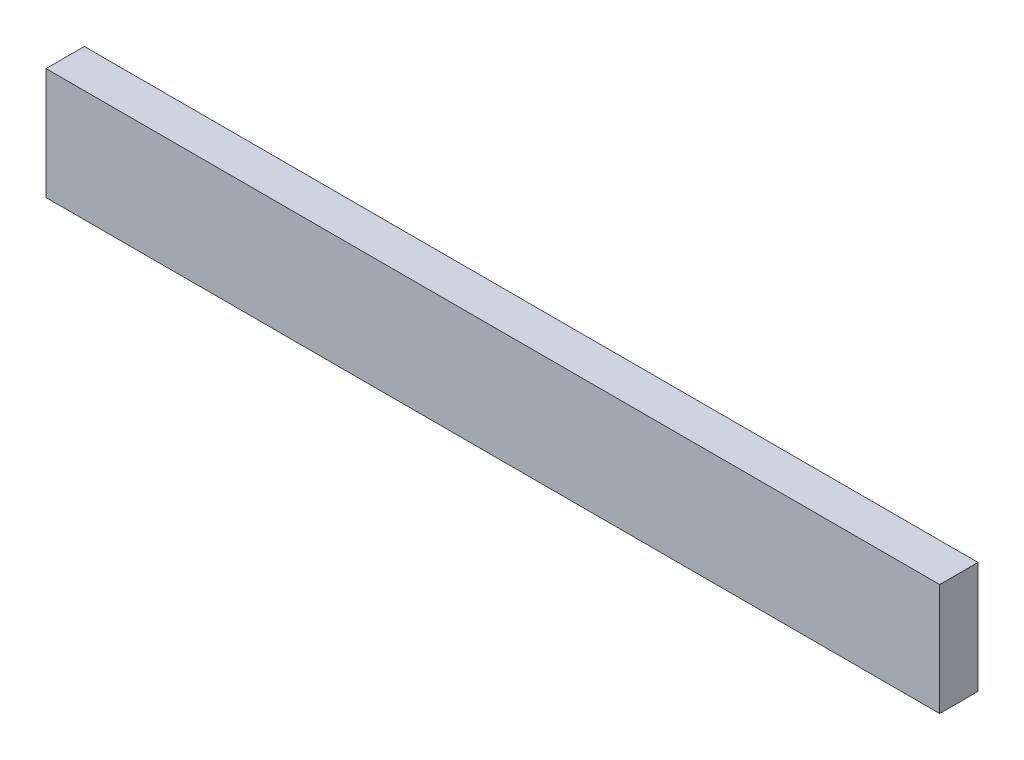
ISO-10303-21;
HEADER;
FILE_DESCRIPTION(('STEP AP214'),'2;1');
FILE_NAME('part.step','',(''),(''),'','','');
FILE_SCHEMA(('AUTOMOTIVE_DESIGN { 1 0 10303 214 1 1 1 1 }'));
ENDSEC;
DATA;
#1=APPLICATION_CONTEXT('core data for automotive mechanical design processes');
#2=APPLICATION_PROTOCOL_DEFINITION('international standard','automotive_design',2000,#1);
#3=PRODUCT_CONTEXT('',#1,'mechanical');
#4=PRODUCT('Part','Part','',(#3));
#5=PRODUCT_RELATED_PRODUCT_CATEGORY('part','',(#4));
#6=PRODUCT_DEFINITION_FORMATION('','',#4);
#7=PRODUCT_DEFINITION_CONTEXT('part definition',#1,'design');
#8=PRODUCT_DEFINITION('design','',#6,#7);
#9=PRODUCT_DEFINITION_SHAPE('','',#8);
#10=(LENGTH_UNIT() NAMED_UNIT(*) SI_UNIT(.MILLI.,.METRE.));
#11=(NAMED_UNIT(*) PLANE_ANGLE_UNIT() SI_UNIT($,.RADIAN.));
#12=(NAMED_UNIT(*) SI_UNIT($,.STERADIAN.) SOLID_ANGLE_UNIT());
#13=UNCERTAINTY_MEASURE_WITH_UNIT(LENGTH_MEASURE(1.E-05),#10,'distance_accuracy_value','');
#14=(GEOMETRIC_REPRESENTATION_CONTEXT(3) GLOBAL_UNCERTAINTY_ASSIGNED_CONTEXT((#13)) GLOBAL_UNIT_ASSIGNED_CONTEXT((#10,
#11,#12)) REPRESENTATION_CONTEXT('',''));
#15=CARTESIAN_POINT('',(0.,0.,0.));
#16=DIRECTION('',(0.,0.,1.));
#17=DIRECTION('',(1.,0.,0.));
#18=AXIS2_PLACEMENT_3D('',#15,#16,#17);
#19=CARTESIAN_POINT('',(140.,-17.5,12.));
#20=DIRECTION('',(-1.,0.,0.));
#21=DIRECTION('',(0.,0.,1.));
#22=AXIS2_PLACEMENT_3D('',#19,#20,#21);
#23=PLANE('',#22);
#24=DIRECTION('',(0.,1.,0.));
#25=VECTOR('',#24,1.);
#26=CARTESIAN_POINT('',(140.,-17.5,0.));
#27=LINE('',#26,#25);
#28=CARTESIAN_POINT('',(140.,-17.5,0.));
#29=VERTEX_POINT('',#28);
#30=CARTESIAN_POINT('',(140.,17.5,0.));
#31=VERTEX_POINT('',#30);
#32=EDGE_CURVE('E113',#29,#31,#27,.T.);
#33=ORIENTED_EDGE('',*,*,#32,.T.);
#34=DIRECTION('',(0.,0.,-1.));
#35=VECTOR('',#34,1.);
#36=CARTESIAN_POINT('',(140.,17.5,12.));
#37=LINE('',#36,#35);
#38=CARTESIAN_POINT('',(140.,17.5,12.));
#39=VERTEX_POINT('',#38);
#40=EDGE_CURVE('E11',#39,#31,#37,.T.);
#41=ORIENTED_EDGE('',*,*,#40,.F.);
#42=DIRECTION('',(0.,1.,0.));
#43=VECTOR('',#42,1.);
#44=CARTESIAN_POINT('',(140.,-17.5,12.));
#45=LINE('',#44,#43);
#46=CARTESIAN_POINT('',(140.,-17.5,12.));
#47=VERTEX_POINT('',#46);
#48=EDGE_CURVE('E97',#47,#39,#45,.T.);
#49=ORIENTED_EDGE('',*,*,#48,.F.);
#50=DIRECTION('',(0.,0.,-1.));
#51=VECTOR('',#50,1.);
#52=CARTESIAN_POINT('',(140.,-17.5,12.));
#53=LINE('',#52,#51);
#54=EDGE_CURVE('E109',#47,#29,#53,.T.);
#55=ORIENTED_EDGE('',*,*,#54,.T.);
#56=EDGE_LOOP('',(#33,#41,#49,#55));
#57=FACE_BOUND('',#56,.T.);
#58=ADVANCED_FACE('F45',(#57),#23,.F.);
#59=CARTESIAN_POINT('',(-140.,17.5,12.));
#60=DIRECTION('',(0.,-1.,0.));
#61=DIRECTION('',(0.,0.,-1.));
#62=AXIS2_PLACEMENT_3D('',#59,#60,#61);
#63=PLANE('',#62);
#64=DIRECTION('',(-1.,0.,0.));
#65=VECTOR('',#64,1.);
#66=CARTESIAN_POINT('',(-140.,17.5,0.));
#67=LINE('',#66,#65);
#68=CARTESIAN_POINT('',(-140.,17.5,0.));
#69=VERTEX_POINT('',#68);
#70=EDGE_CURVE('E102',#31,#69,#67,.T.);
#71=ORIENTED_EDGE('',*,*,#70,.T.);
#72=DIRECTION('',(0.,0.,-1.));
#73=VECTOR('',#72,1.);
#74=CARTESIAN_POINT('',(-140.,17.5,12.));
#75=LINE('',#74,#73);
#76=CARTESIAN_POINT('',(-140.,17.5,12.));
#77=VERTEX_POINT('',#76);
#78=EDGE_CURVE('E54',#77,#69,#75,.T.);
#79=ORIENTED_EDGE('',*,*,#78,.F.);
#80=DIRECTION('',(-1.,0.,0.));
#81=VECTOR('',#80,1.);
#82=CARTESIAN_POINT('',(-140.,17.5,12.));
#83=LINE('',#82,#81);
#84=EDGE_CURVE('E92',#39,#77,#83,.T.);
#85=ORIENTED_EDGE('',*,*,#84,.F.);
#86=ORIENTED_EDGE('',*,*,#40,.T.);
#87=EDGE_LOOP('',(#71,#79,#85,#86));
#88=FACE_BOUND('',#87,.T.);
#89=ADVANCED_FACE('F101',(#88),#63,.F.);
#90=CARTESIAN_POINT('',(-140.,-17.5,12.));
#91=DIRECTION('',(1.,0.,0.));
#92=DIRECTION('',(0.,0.,-1.));
#93=AXIS2_PLACEMENT_3D('',#90,#91,#92);
#94=PLANE('',#93);
#95=DIRECTION('',(0.,-1.,0.));
#96=VECTOR('',#95,1.);
#97=CARTESIAN_POINT('',(-140.,-17.5,0.));
#98=LINE('',#97,#96);
#99=CARTESIAN_POINT('',(-140.,-17.5,0.));
#100=VERTEX_POINT('',#99);
#101=EDGE_CURVE('E79',#69,#100,#98,.T.);
#102=ORIENTED_EDGE('',*,*,#101,.T.);
#103=DIRECTION('',(0.,0.,-1.));
#104=VECTOR('',#103,1.);
#105=CARTESIAN_POINT('',(-140.,-17.5,12.));
#106=LINE('',#105,#104);
#107=CARTESIAN_POINT('',(-140.,-17.5,12.));
#108=VERTEX_POINT('',#107);
#109=EDGE_CURVE('E104',#108,#100,#106,.T.);
#110=ORIENTED_EDGE('',*,*,#109,.F.);
#111=DIRECTION('',(0.,-1.,0.));
#112=VECTOR('',#111,1.);
#113=CARTESIAN_POINT('',(-140.,-17.5,12.));
#114=LINE('',#113,#112);
#115=EDGE_CURVE('E95',#77,#108,#114,.T.);
#116=ORIENTED_EDGE('',*,*,#115,.F.);
#117=ORIENTED_EDGE('',*,*,#78,.T.);
#118=EDGE_LOOP('',(#102,#110,#116,#117));
#119=FACE_BOUND('',#118,.T.);
#120=ADVANCED_FACE('F105',(#119),#94,.F.);
#121=CARTESIAN_POINT('',(-140.,-17.5,12.));
#122=DIRECTION('',(0.,1.,0.));
#123=DIRECTION('',(0.,0.,1.));
#124=AXIS2_PLACEMENT_3D('',#121,#122,#123);
#125=PLANE('',#124);
#126=DIRECTION('',(1.,0.,0.));
#127=VECTOR('',#126,1.);
#128=CARTESIAN_POINT('',(-140.,-17.5,0.));
#129=LINE('',#128,#127);
#130=EDGE_CURVE('E85',#100,#29,#129,.T.);
#131=ORIENTED_EDGE('',*,*,#130,.T.);
#132=ORIENTED_EDGE('',*,*,#54,.F.);
#133=DIRECTION('',(1.,0.,0.));
#134=VECTOR('',#133,1.);
#135=CARTESIAN_POINT('',(-140.,-17.5,12.));
#136=LINE('',#135,#134);
#137=EDGE_CURVE('E62',#108,#47,#136,.T.);
#138=ORIENTED_EDGE('',*,*,#137,.F.);
#139=ORIENTED_EDGE('',*,*,#109,.T.);
#140=EDGE_LOOP('',(#131,#132,#138,#139));
#141=FACE_BOUND('',#140,.T.);
#142=ADVANCED_FACE('F126',(#141),#125,.F.);
#143=CARTESIAN_POINT('',(0.,0.,12.));
#144=DIRECTION('',(0.,0.,-1.));
#145=DIRECTION('',(-1.,0.,0.));
#146=AXIS2_PLACEMENT_3D('',#143,#144,#145);
#147=PLANE('',#146);
#148=ORIENTED_EDGE('',*,*,#48,.T.);
#149=ORIENTED_EDGE('',*,*,#84,.T.);
#150=ORIENTED_EDGE('',*,*,#115,.T.);
#151=ORIENTED_EDGE('',*,*,#137,.T.);
#152=EDGE_LOOP('',(#148,#149,#150,#151));
#153=FACE_BOUND('',#152,.T.);
#154=ADVANCED_FACE('F93',(#153),#147,.F.);
#155=CARTESIAN_POINT('',(0.,0.,0.));
#156=DIRECTION('',(0.,0.,-1.));
#157=DIRECTION('',(-1.,0.,0.));
#158=AXIS2_PLACEMENT_3D('',#155,#156,#157);
#159=PLANE('',#158);
#160=ORIENTED_EDGE('',*,*,#32,.F.);
#161=ORIENTED_EDGE('',*,*,#130,.F.);
#162=ORIENTED_EDGE('',*,*,#101,.F.);
#163=ORIENTED_EDGE('',*,*,#70,.F.);
#164=EDGE_LOOP('',(#160,#161,#162,#163));
#165=FACE_BOUND('',#164,.T.);
#166=ADVANCED_FACE('F129',(#165),#159,.T.);
#167=CLOSED_SHELL('',(#58,#89,#120,#142,#154,#166));
#168=MANIFOLD_SOLID_BREP('B2',#167);
#169=ADVANCED_BREP_SHAPE_REPRESENTATION('',(#18,#168),#14);
#170=SHAPE_DEFINITION_REPRESENTATION(#9,#169);
ENDSEC;
END-ISO-10303-21;
